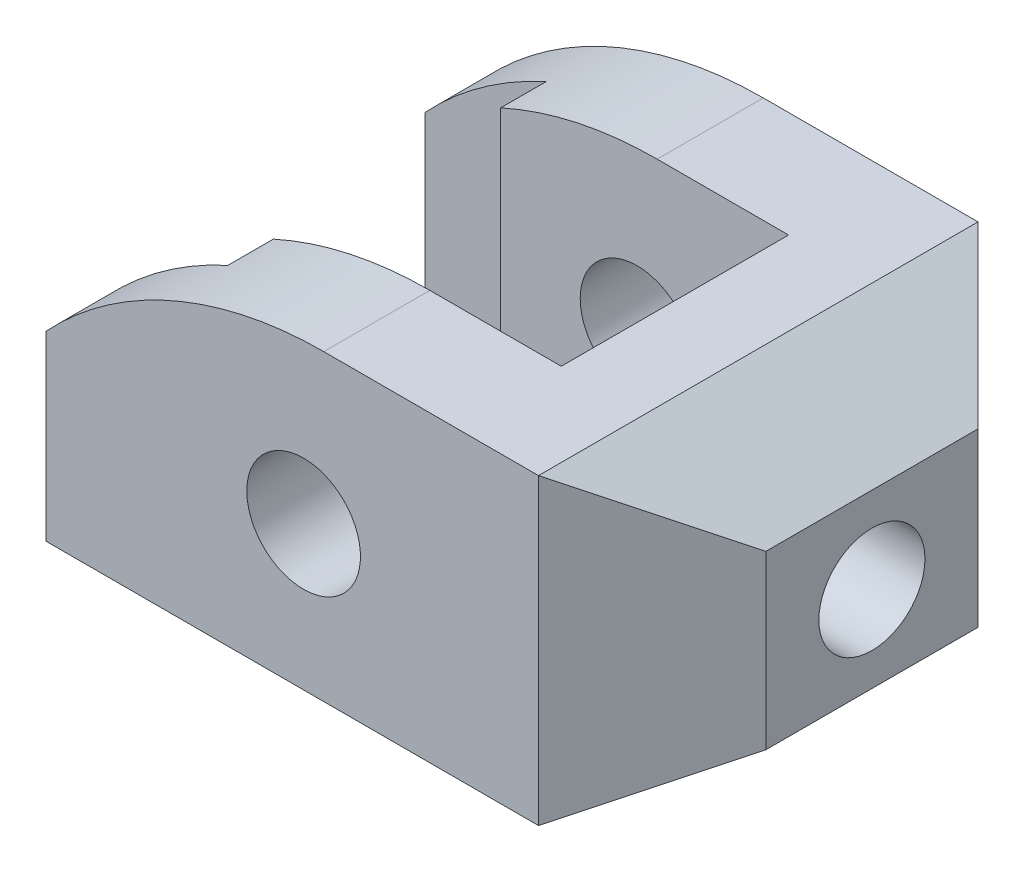
ISO-10303-21;
HEADER;
FILE_DESCRIPTION(('STEP AP214'),'2;1');
FILE_NAME('part.step','',(''),(''),'','','');
FILE_SCHEMA(('AUTOMOTIVE_DESIGN { 1 0 10303 214 1 1 1 1 }'));
ENDSEC;
DATA;
#1=APPLICATION_CONTEXT('core data for automotive mechanical design processes');
#2=APPLICATION_PROTOCOL_DEFINITION('international standard','automotive_design',2000,#1);
#3=PRODUCT_CONTEXT('',#1,'mechanical');
#4=PRODUCT('Part','Part','',(#3));
#5=PRODUCT_RELATED_PRODUCT_CATEGORY('part','',(#4));
#6=PRODUCT_DEFINITION_FORMATION('','',#4);
#7=PRODUCT_DEFINITION_CONTEXT('part definition',#1,'design');
#8=PRODUCT_DEFINITION('design','',#6,#7);
#9=PRODUCT_DEFINITION_SHAPE('','',#8);
#10=(LENGTH_UNIT() NAMED_UNIT(*) SI_UNIT(.MILLI.,.METRE.));
#11=(NAMED_UNIT(*) PLANE_ANGLE_UNIT() SI_UNIT($,.RADIAN.));
#12=(NAMED_UNIT(*) SI_UNIT($,.STERADIAN.) SOLID_ANGLE_UNIT());
#13=UNCERTAINTY_MEASURE_WITH_UNIT(LENGTH_MEASURE(1.E-05),#10,'distance_accuracy_value','');
#14=(GEOMETRIC_REPRESENTATION_CONTEXT(3) GLOBAL_UNCERTAINTY_ASSIGNED_CONTEXT((#13)) GLOBAL_UNIT_ASSIGNED_CONTEXT((#10,
#11,#12)) REPRESENTATION_CONTEXT('',''));
#15=CARTESIAN_POINT('',(0.,0.,0.));
#16=DIRECTION('',(0.,0.,1.));
#17=DIRECTION('',(1.,0.,0.));
#18=AXIS2_PLACEMENT_3D('',#15,#16,#17);
#19=CARTESIAN_POINT('',(-28.3393944403533,-10.,58.));
#20=DIRECTION('',(0.,0.,-1.));
#21=DIRECTION('',(-1.,0.,0.));
#22=AXIS2_PLACEMENT_3D('',#19,#20,#21);
#23=PLANE('',#22);
#24=CARTESIAN_POINT('',(-31.,19.,58.));
#25=DIRECTION('',(0.,0.,1.));
#26=DIRECTION('',(1.,0.,0.));
#27=AXIS2_PLACEMENT_3D('',#24,#25,#26);
#28=CIRCLE('',#27,7.5);
#29=CARTESIAN_POINT('',(-38.5,19.,58.));
#30=VERTEX_POINT('',#29);
#31=EDGE_CURVE('E207',#30,#30,#28,.T.);
#32=ORIENTED_EDGE('',*,*,#31,.F.);
#33=EDGE_LOOP('',(#32));
#34=FACE_BOUND('',#33,.T.);
#35=DIRECTION('',(0.,-1.,0.));
#36=VECTOR('',#35,1.);
#37=CARTESIAN_POINT('',(0.,40.,58.));
#38=LINE('',#37,#36);
#39=CARTESIAN_POINT('',(0.,40.,58.));
#40=VERTEX_POINT('',#39);
#41=CARTESIAN_POINT('',(0.,0.,58.));
#42=VERTEX_POINT('',#41);
#43=EDGE_CURVE('E156',#40,#42,#38,.T.);
#44=ORIENTED_EDGE('',*,*,#43,.F.);
#45=DIRECTION('',(-1.,0.,0.));
#46=VECTOR('',#45,1.);
#47=CARTESIAN_POINT('',(0.,40.,58.));
#48=LINE('',#47,#46);
#49=CARTESIAN_POINT('',(-28.3393944403533,40.,58.));
#50=VERTEX_POINT('',#49);
#51=EDGE_CURVE('E167',#40,#50,#48,.T.);
#52=ORIENTED_EDGE('',*,*,#51,.T.);
#53=CARTESIAN_POINT('',(-28.3393944403533,-10.,58.));
#54=DIRECTION('',(0.,0.,1.));
#55=DIRECTION('',(-1.,0.,0.));
#56=AXIS2_PLACEMENT_3D('',#53,#54,#55);
#57=CIRCLE('',#56,50.);
#58=CARTESIAN_POINT('',(-65.,24.,58.));
#59=VERTEX_POINT('',#58);
#60=EDGE_CURVE('E189',#50,#59,#57,.T.);
#61=ORIENTED_EDGE('',*,*,#60,.T.);
#62=DIRECTION('',(0.,-1.,0.));
#63=VECTOR('',#62,1.);
#64=CARTESIAN_POINT('',(-65.,0.,58.));
#65=LINE('',#64,#63);
#66=CARTESIAN_POINT('',(-65.,0.,58.));
#67=VERTEX_POINT('',#66);
#68=EDGE_CURVE('E192',#59,#67,#65,.T.);
#69=ORIENTED_EDGE('',*,*,#68,.T.);
#70=DIRECTION('',(1.,0.,0.));
#71=VECTOR('',#70,1.);
#72=CARTESIAN_POINT('',(0.,0.,58.));
#73=LINE('',#72,#71);
#74=EDGE_CURVE('E170',#67,#42,#73,.T.);
#75=ORIENTED_EDGE('',*,*,#74,.T.);
#76=EDGE_LOOP('',(#44,#52,#61,#69,#75));
#77=FACE_BOUND('',#76,.T.);
#78=ADVANCED_FACE('F43',(#34,#77),#23,.F.);
#79=CARTESIAN_POINT('',(-28.3393944403533,-10.,0.));
#80=DIRECTION('',(0.,0.,-1.));
#81=DIRECTION('',(-1.,0.,0.));
#82=AXIS2_PLACEMENT_3D('',#79,#80,#81);
#83=PLANE('',#82);
#84=CARTESIAN_POINT('',(-31.,19.,0.));
#85=DIRECTION('',(0.,0.,1.));
#86=DIRECTION('',(1.,0.,0.));
#87=AXIS2_PLACEMENT_3D('',#84,#85,#86);
#88=CIRCLE('',#87,7.5);
#89=CARTESIAN_POINT('',(-38.5,19.,0.));
#90=VERTEX_POINT('',#89);
#91=EDGE_CURVE('E198',#90,#90,#88,.T.);
#92=ORIENTED_EDGE('',*,*,#91,.T.);
#93=EDGE_LOOP('',(#92));
#94=FACE_BOUND('',#93,.T.);
#95=DIRECTION('',(-1.,0.,0.));
#96=VECTOR('',#95,1.);
#97=CARTESIAN_POINT('',(0.,40.,0.));
#98=LINE('',#97,#96);
#99=CARTESIAN_POINT('',(0.,40.,0.));
#100=VERTEX_POINT('',#99);
#101=CARTESIAN_POINT('',(-28.3393944403533,40.,0.));
#102=VERTEX_POINT('',#101);
#103=EDGE_CURVE('E204',#100,#102,#98,.T.);
#104=ORIENTED_EDGE('',*,*,#103,.F.);
#105=DIRECTION('',(0.,-1.,0.));
#106=VECTOR('',#105,1.);
#107=CARTESIAN_POINT('',(0.,40.,0.));
#108=LINE('',#107,#106);
#109=CARTESIAN_POINT('',(0.,0.,0.));
#110=VERTEX_POINT('',#109);
#111=EDGE_CURVE('E322',#100,#110,#108,.T.);
#112=ORIENTED_EDGE('',*,*,#111,.T.);
#113=DIRECTION('',(1.,0.,0.));
#114=VECTOR('',#113,1.);
#115=CARTESIAN_POINT('',(0.,0.,0.));
#116=LINE('',#115,#114);
#117=CARTESIAN_POINT('',(-65.,0.,0.));
#118=VERTEX_POINT('',#117);
#119=EDGE_CURVE('E190',#118,#110,#116,.T.);
#120=ORIENTED_EDGE('',*,*,#119,.F.);
#121=DIRECTION('',(0.,-1.,0.));
#122=VECTOR('',#121,1.);
#123=CARTESIAN_POINT('',(-65.,0.,0.));
#124=LINE('',#123,#122);
#125=CARTESIAN_POINT('',(-65.,24.,0.));
#126=VERTEX_POINT('',#125);
#127=EDGE_CURVE('E195',#126,#118,#124,.T.);
#128=ORIENTED_EDGE('',*,*,#127,.F.);
#129=CARTESIAN_POINT('',(-28.3393944403533,-10.,0.));
#130=DIRECTION('',(0.,0.,1.));
#131=DIRECTION('',(-1.,0.,0.));
#132=AXIS2_PLACEMENT_3D('',#129,#130,#131);
#133=CIRCLE('',#132,50.);
#134=EDGE_CURVE('E206',#102,#126,#133,.T.);
#135=ORIENTED_EDGE('',*,*,#134,.F.);
#136=EDGE_LOOP('',(#104,#112,#120,#128,#135));
#137=FACE_BOUND('',#136,.T.);
#138=ADVANCED_FACE('F263',(#94,#137),#83,.T.);
#139=CARTESIAN_POINT('',(0.,0.,58.));
#140=DIRECTION('',(-0.499999999999995,0.866025403784441,0.));
#141=DIRECTION('',(-0.866025403784442,-0.499999999999995,0.));
#142=AXIS2_PLACEMENT_3D('',#139,#140,#141);
#143=PLANE('',#142);
#144=DIRECTION('',(-0.654653670707977,-0.377964473009222,-0.65465367070798));
#145=VECTOR('',#144,1.);
#146=CARTESIAN_POINT('',(24.857142857143,14.3512781198563,24.857142857143));
#147=LINE('',#146,#145);
#148=CARTESIAN_POINT('',(15.,8.66025403784428,15.));
#149=VERTEX_POINT('',#148);
#150=EDGE_CURVE('E331',#149,#110,#147,.T.);
#151=ORIENTED_EDGE('',*,*,#150,.F.);
#152=DIRECTION('',(0.,0.,-1.));
#153=VECTOR('',#152,1.);
#154=CARTESIAN_POINT('',(15.,8.66025403784427,58.));
#155=LINE('',#154,#153);
#156=CARTESIAN_POINT('',(15.,8.66025403784428,43.));
#157=VERTEX_POINT('',#156);
#158=EDGE_CURVE('E162',#157,#149,#155,.T.);
#159=ORIENTED_EDGE('',*,*,#158,.F.);
#160=DIRECTION('',(0.654653670707977,0.377964473009222,-0.65465367070798));
#161=VECTOR('',#160,1.);
#162=CARTESIAN_POINT('',(0.,0.,58.));
#163=LINE('',#162,#161);
#164=EDGE_CURVE('E325',#42,#157,#163,.T.);
#165=ORIENTED_EDGE('',*,*,#164,.F.);
#166=DIRECTION('',(0.,0.,-1.));
#167=VECTOR('',#166,1.);
#168=CARTESIAN_POINT('',(0.,0.,58.));
#169=LINE('',#168,#167);
#170=EDGE_CURVE('E203',#42,#110,#169,.T.);
#171=ORIENTED_EDGE('',*,*,#170,.T.);
#172=EDGE_LOOP('',(#151,#159,#165,#171));
#173=FACE_BOUND('',#172,.T.);
#174=ADVANCED_FACE('F45',(#173),#143,.F.);
#175=CARTESIAN_POINT('',(15.,8.66025403784427,58.));
#176=DIRECTION('',(-1.,0.,0.));
#177=DIRECTION('',(0.,-1.,0.));
#178=AXIS2_PLACEMENT_3D('',#175,#176,#177);
#179=PLANE('',#178);
#180=CARTESIAN_POINT('',(15.,20.,29.));
#181=DIRECTION('',(-1.,0.,0.));
#182=DIRECTION('',(0.,-1.,0.));
#183=AXIS2_PLACEMENT_3D('',#180,#181,#182);
#184=CIRCLE('',#183,7.);
#185=CARTESIAN_POINT('',(15.,13.,29.));
#186=VERTEX_POINT('',#185);
#187=EDGE_CURVE('E317',#186,#186,#184,.T.);
#188=ORIENTED_EDGE('',*,*,#187,.T.);
#189=EDGE_LOOP('',(#188));
#190=FACE_BOUND('',#189,.T.);
#191=DIRECTION('',(0.,-1.,0.));
#192=VECTOR('',#191,1.);
#193=CARTESIAN_POINT('',(15.,40.,15.));
#194=LINE('',#193,#192);
#195=CARTESIAN_POINT('',(15.,31.3397459621556,15.));
#196=VERTEX_POINT('',#195);
#197=EDGE_CURVE('E172',#196,#149,#194,.T.);
#198=ORIENTED_EDGE('',*,*,#197,.F.);
#199=DIRECTION('',(0.,0.,-1.));
#200=VECTOR('',#199,1.);
#201=CARTESIAN_POINT('',(15.,31.3397459621556,58.));
#202=LINE('',#201,#200);
#203=CARTESIAN_POINT('',(15.,31.3397459621556,43.));
#204=VERTEX_POINT('',#203);
#205=EDGE_CURVE('E181',#204,#196,#202,.T.);
#206=ORIENTED_EDGE('',*,*,#205,.F.);
#207=DIRECTION('',(0.,-1.,0.));
#208=VECTOR('',#207,1.);
#209=CARTESIAN_POINT('',(15.,40.,43.));
#210=LINE('',#209,#208);
#211=EDGE_CURVE('E59',#204,#157,#210,.T.);
#212=ORIENTED_EDGE('',*,*,#211,.T.);
#213=ORIENTED_EDGE('',*,*,#158,.T.);
#214=EDGE_LOOP('',(#198,#206,#212,#213));
#215=FACE_BOUND('',#214,.T.);
#216=ADVANCED_FACE('F305',(#190,#215),#179,.F.);
#217=CARTESIAN_POINT('',(15.,31.3397459621556,58.));
#218=DIRECTION('',(-0.500000000000001,-0.866025403784438,0.));
#219=DIRECTION('',(0.866025403784438,-0.500000000000001,0.));
#220=AXIS2_PLACEMENT_3D('',#217,#218,#219);
#221=PLANE('',#220);
#222=DIRECTION('',(0.654653670707976,-0.377964473009227,0.654653670707978));
#223=VECTOR('',#222,1.);
#224=CARTESIAN_POINT('',(33.4285714285714,20.7000052870896,33.4285714285715));
#225=LINE('',#224,#223);
#226=EDGE_CURVE('E11',#100,#196,#225,.T.);
#227=ORIENTED_EDGE('',*,*,#226,.F.);
#228=DIRECTION('',(0.,0.,-1.));
#229=VECTOR('',#228,1.);
#230=CARTESIAN_POINT('',(0.,40.,58.));
#231=LINE('',#230,#229);
#232=EDGE_CURVE('E176',#40,#100,#231,.T.);
#233=ORIENTED_EDGE('',*,*,#232,.F.);
#234=DIRECTION('',(-0.654653670707976,0.377964473009227,0.654653670707978));
#235=VECTOR('',#234,1.);
#236=CARTESIAN_POINT('',(8.57142857142856,35.0512834069461,49.4285714285714));
#237=LINE('',#236,#235);
#238=EDGE_CURVE('E52',#204,#40,#237,.T.);
#239=ORIENTED_EDGE('',*,*,#238,.F.);
#240=ORIENTED_EDGE('',*,*,#205,.T.);
#241=EDGE_LOOP('',(#227,#233,#239,#240));
#242=FACE_BOUND('',#241,.T.);
#243=ADVANCED_FACE('F177',(#242),#221,.F.);
#244=CARTESIAN_POINT('',(-28.3393944403533,-10.,58.));
#245=DIRECTION('',(0.,0.,-1.));
#246=DIRECTION('',(-1.,0.,0.));
#247=AXIS2_PLACEMENT_3D('',#244,#245,#246);
#248=CYLINDRICAL_SURFACE('',#247,50.);
#249=DIRECTION('',(0.,0.,-1.));
#250=VECTOR('',#249,1.);
#251=CARTESIAN_POINT('',(-28.3393944403533,40.,58.));
#252=LINE('',#251,#250);
#253=CARTESIAN_POINT('',(-28.3393944403533,40.,44.));
#254=VERTEX_POINT('',#253);
#255=EDGE_CURVE('E182',#50,#254,#252,.T.);
#256=ORIENTED_EDGE('',*,*,#255,.T.);
#257=CARTESIAN_POINT('',(-28.3393944403533,-10.,44.));
#258=DIRECTION('',(0.,0.,1.));
#259=DIRECTION('',(1.,0.,0.));
#260=AXIS2_PLACEMENT_3D('',#257,#258,#259);
#261=CIRCLE('',#260,50.);
#262=CARTESIAN_POINT('',(-49.,35.5317403347236,44.));
#263=VERTEX_POINT('',#262);
#264=EDGE_CURVE('E230',#254,#263,#261,.T.);
#265=ORIENTED_EDGE('',*,*,#264,.T.);
#266=DIRECTION('',(0.,0.,-1.));
#267=VECTOR('',#266,1.);
#268=CARTESIAN_POINT('',(-49.,35.5317403347236,58.));
#269=LINE('',#268,#267);
#270=CARTESIAN_POINT('',(-49.,35.5317403347236,50.));
#271=VERTEX_POINT('',#270);
#272=EDGE_CURVE('E256',#263,#271,#269,.F.);
#273=ORIENTED_EDGE('',*,*,#272,.T.);
#274=CARTESIAN_POINT('',(-28.3393944403533,-10.,50.));
#275=DIRECTION('',(0.,0.,1.));
#276=DIRECTION('',(1.,0.,0.));
#277=AXIS2_PLACEMENT_3D('',#274,#275,#276);
#278=CIRCLE('',#277,50.);
#279=CARTESIAN_POINT('',(-65.,24.,50.));
#280=VERTEX_POINT('',#279);
#281=EDGE_CURVE('E253',#271,#280,#278,.T.);
#282=ORIENTED_EDGE('',*,*,#281,.T.);
#283=DIRECTION('',(0.,0.,-1.));
#284=VECTOR('',#283,1.);
#285=CARTESIAN_POINT('',(-65.,24.,58.));
#286=LINE('',#285,#284);
#287=EDGE_CURVE('E219',#59,#280,#286,.T.);
#288=ORIENTED_EDGE('',*,*,#287,.F.);
#289=ORIENTED_EDGE('',*,*,#60,.F.);
#290=EDGE_LOOP('',(#256,#265,#273,#282,#288,#289));
#291=FACE_BOUND('',#290,.T.);
#292=ADVANCED_FACE('F279',(#291),#248,.T.);
#293=CARTESIAN_POINT('',(-65.,0.,58.));
#294=DIRECTION('',(1.,0.,0.));
#295=DIRECTION('',(0.,0.,-1.));
#296=AXIS2_PLACEMENT_3D('',#293,#294,#295);
#297=PLANE('',#296);
#298=ORIENTED_EDGE('',*,*,#287,.T.);
#299=DIRECTION('',(0.,1.,0.));
#300=VECTOR('',#299,1.);
#301=CARTESIAN_POINT('',(-65.,0.,50.));
#302=LINE('',#301,#300);
#303=CARTESIAN_POINT('',(-65.,0.,50.));
#304=VERTEX_POINT('',#303);
#305=EDGE_CURVE('E369',#304,#280,#302,.T.);
#306=ORIENTED_EDGE('',*,*,#305,.F.);
#307=DIRECTION('',(0.,0.,-1.));
#308=VECTOR('',#307,1.);
#309=CARTESIAN_POINT('',(-65.,0.,58.));
#310=LINE('',#309,#308);
#311=EDGE_CURVE('E215',#67,#304,#310,.T.);
#312=ORIENTED_EDGE('',*,*,#311,.F.);
#313=ORIENTED_EDGE('',*,*,#68,.F.);
#314=EDGE_LOOP('',(#298,#306,#312,#313));
#315=FACE_BOUND('',#314,.T.);
#316=ADVANCED_FACE('F268',(#315),#297,.F.);
#317=CARTESIAN_POINT('',(-31.,19.,58.));
#318=DIRECTION('',(0.,0.,-1.));
#319=DIRECTION('',(-1.,0.,0.));
#320=AXIS2_PLACEMENT_3D('',#317,#318,#319);
#321=CYLINDRICAL_SURFACE('',#320,7.5);
#322=CARTESIAN_POINT('',(-31.,19.,14.));
#323=DIRECTION('',(0.,0.,-1.));
#324=DIRECTION('',(-1.,0.,0.));
#325=AXIS2_PLACEMENT_3D('',#322,#323,#324);
#326=CIRCLE('',#325,7.5);
#327=CARTESIAN_POINT('',(-38.5,19.,14.));
#328=VERTEX_POINT('',#327);
#329=EDGE_CURVE('E232',#328,#328,#326,.T.);
#330=CARTESIAN_POINT('',(-38.5,19.,14.));
#331=CARTESIAN_POINT('',(-38.5,19.,13.8541666666667));
#332=CARTESIAN_POINT('',(-38.5,19.,13.7083333333333));
#333=CARTESIAN_POINT('',(-38.5,19.,13.4166666666667));
#334=CARTESIAN_POINT('',(-38.5,19.,13.2708333333333));
#335=CARTESIAN_POINT('',(-38.5,19.,12.9791666666667));
#336=CARTESIAN_POINT('',(-38.5,19.,12.8333333333333));
#337=CARTESIAN_POINT('',(-38.5,19.,12.5416666666667));
#338=CARTESIAN_POINT('',(-38.5,19.,12.3958333333333));
#339=CARTESIAN_POINT('',(-38.5,19.,12.1041666666667));
#340=CARTESIAN_POINT('',(-38.5,19.,11.9583333333333));
#341=CARTESIAN_POINT('',(-38.5,19.,11.6666666666667));
#342=CARTESIAN_POINT('',(-38.5,19.,11.5208333333333));
#343=CARTESIAN_POINT('',(-38.5,19.,11.2291666666667));
#344=CARTESIAN_POINT('',(-38.5,19.,11.0833333333333));
#345=CARTESIAN_POINT('',(-38.5,19.,10.7916666666667));
#346=CARTESIAN_POINT('',(-38.5,19.,10.6458333333333));
#347=CARTESIAN_POINT('',(-38.5,19.,10.3541666666667));
#348=CARTESIAN_POINT('',(-38.5,19.,10.2083333333333));
#349=CARTESIAN_POINT('',(-38.5,19.,9.91666666666667));
#350=CARTESIAN_POINT('',(-38.5,19.,9.77083333333333));
#351=CARTESIAN_POINT('',(-38.5,19.,9.47916666666667));
#352=CARTESIAN_POINT('',(-38.5,19.,9.33333333333333));
#353=CARTESIAN_POINT('',(-38.5,19.,9.04166666666667));
#354=CARTESIAN_POINT('',(-38.5,19.,8.89583333333333));
#355=CARTESIAN_POINT('',(-38.5,19.,8.60416666666667));
#356=CARTESIAN_POINT('',(-38.5,19.,8.45833333333333));
#357=CARTESIAN_POINT('',(-38.5,19.,8.16666666666667));
#358=CARTESIAN_POINT('',(-38.5,19.,8.02083333333333));
#359=CARTESIAN_POINT('',(-38.5,19.,7.72916666666667));
#360=CARTESIAN_POINT('',(-38.5,19.,7.58333333333333));
#361=CARTESIAN_POINT('',(-38.5,19.,7.29166666666667));
#362=CARTESIAN_POINT('',(-38.5,19.,7.14583333333333));
#363=CARTESIAN_POINT('',(-38.5,19.,6.85416666666667));
#364=CARTESIAN_POINT('',(-38.5,19.,6.70833333333333));
#365=CARTESIAN_POINT('',(-38.5,19.,6.41666666666667));
#366=CARTESIAN_POINT('',(-38.5,19.,6.27083333333333));
#367=CARTESIAN_POINT('',(-38.5,19.,5.97916666666667));
#368=CARTESIAN_POINT('',(-38.5,19.,5.83333333333333));
#369=CARTESIAN_POINT('',(-38.5,19.,5.54166666666666));
#370=CARTESIAN_POINT('',(-38.5,19.,5.39583333333333));
#371=CARTESIAN_POINT('',(-38.5,19.,5.10416666666666));
#372=CARTESIAN_POINT('',(-38.5,19.,4.95833333333333));
#373=CARTESIAN_POINT('',(-38.5,19.,4.66666666666667));
#374=CARTESIAN_POINT('',(-38.5,19.,4.52083333333333));
#375=CARTESIAN_POINT('',(-38.5,19.,4.22916666666667));
#376=CARTESIAN_POINT('',(-38.5,19.,4.08333333333333));
#377=CARTESIAN_POINT('',(-38.5,19.,3.79166666666667));
#378=CARTESIAN_POINT('',(-38.5,19.,3.64583333333333));
#379=CARTESIAN_POINT('',(-38.5,19.,3.35416666666667));
#380=CARTESIAN_POINT('',(-38.5,19.,3.20833333333333));
#381=CARTESIAN_POINT('',(-38.5,19.,2.91666666666666));
#382=CARTESIAN_POINT('',(-38.5,19.,2.77083333333333));
#383=CARTESIAN_POINT('',(-38.5,19.,2.47916666666667));
#384=CARTESIAN_POINT('',(-38.5,19.,2.33333333333334));
#385=CARTESIAN_POINT('',(-38.5,19.,2.04166666666667));
#386=CARTESIAN_POINT('',(-38.5,19.,1.89583333333333));
#387=CARTESIAN_POINT('',(-38.5,19.,1.60416666666667));
#388=CARTESIAN_POINT('',(-38.5,19.,1.45833333333333));
#389=CARTESIAN_POINT('',(-38.5,19.,1.16666666666667));
#390=CARTESIAN_POINT('',(-38.5,19.,1.02083333333333));
#391=CARTESIAN_POINT('',(-38.5,19.,0.729166666666667));
#392=CARTESIAN_POINT('',(-38.5,19.,0.583333333333334));
#393=CARTESIAN_POINT('',(-38.5,19.,0.291666666666667));
#394=CARTESIAN_POINT('',(-38.5,19.,0.145833333333333));
#395=CARTESIAN_POINT('',(-38.5,19.,0.));
#396=B_SPLINE_CURVE_WITH_KNOTS('',3,(#330,#331,#332,#333,#334,#335,#336,#337,#338,#339,#340,
#341,#342,#343,#344,#345,#346,#347,#348,#349,#350,#351,#352,#353,#354,#355,#356,#357,#358,#359,
#360,#361,#362,#363,#364,#365,#366,#367,#368,#369,#370,#371,#372,#373,#374,#375,#376,#377,#378,
#379,#380,#381,#382,#383,#384,#385,#386,#387,#388,#389,#390,#391,#392,#393,#394,#395),
.UNSPECIFIED.,.F.,.F.,(4,2,2,2,2,2,2,2,2,2,2,2,2,2,2,2,2,2,2,2,2,2,2,2,2,2,2,2,2,2,2,2,4),(0.,
0.4375,0.875000000000001,1.3125,1.75,2.1875,2.625,3.0625,3.5,3.9375,4.375,4.8125,5.25,5.6875,
6.125,6.5625,7.,7.4375,7.875,8.3125,8.75,9.1875,9.62499999999999,10.0625,10.5,10.9375,11.375,
11.8125,12.25,12.6875,13.125,13.5625,14.),.UNSPECIFIED.);
#397=EDGE_CURVE('BSEAM266',#328,#90,#396,.T.);
#398=ORIENTED_EDGE('',*,*,#329,.F.);
#399=ORIENTED_EDGE('',*,*,#91,.F.);
#400=ORIENTED_EDGE('',*,*,#397,.T.);
#401=ORIENTED_EDGE('',*,*,#397,.F.);
#402=EDGE_LOOP('',(#398,#400,#399,#401));
#403=FACE_BOUND('',#402,.T.);
#404=ADVANCED_FACE('F266',(#403),#321,.F.);
#405=CARTESIAN_POINT('',(0.,40.,58.));
#406=DIRECTION('',(0.,-1.,0.));
#407=DIRECTION('',(1.,0.,0.));
#408=AXIS2_PLACEMENT_3D('',#405,#406,#407);
#409=PLANE('',#408);
#410=CARTESIAN_POINT('',(-28.3393944403533,40.,14.));
#411=VERTEX_POINT('',#410);
#412=EDGE_CURVE('E222',#411,#102,#252,.T.);
#413=ORIENTED_EDGE('',*,*,#412,.F.);
#414=DIRECTION('',(-1.,0.,0.));
#415=VECTOR('',#414,1.);
#416=CARTESIAN_POINT('',(-11.,40.,14.));
#417=LINE('',#416,#415);
#418=CARTESIAN_POINT('',(-11.,40.,14.));
#419=VERTEX_POINT('',#418);
#420=EDGE_CURVE('E333',#419,#411,#417,.T.);
#421=ORIENTED_EDGE('',*,*,#420,.F.);
#422=DIRECTION('',(0.,0.,-1.));
#423=VECTOR('',#422,1.);
#424=CARTESIAN_POINT('',(-11.,40.,44.));
#425=LINE('',#424,#423);
#426=CARTESIAN_POINT('',(-11.,40.,44.));
#427=VERTEX_POINT('',#426);
#428=EDGE_CURVE('E337',#427,#419,#425,.T.);
#429=ORIENTED_EDGE('',*,*,#428,.F.);
#430=DIRECTION('',(1.,0.,0.));
#431=VECTOR('',#430,1.);
#432=CARTESIAN_POINT('',(-11.,40.,44.));
#433=LINE('',#432,#431);
#434=EDGE_CURVE('E335',#254,#427,#433,.T.);
#435=ORIENTED_EDGE('',*,*,#434,.F.);
#436=ORIENTED_EDGE('',*,*,#255,.F.);
#437=ORIENTED_EDGE('',*,*,#51,.F.);
#438=ORIENTED_EDGE('',*,*,#232,.T.);
#439=ORIENTED_EDGE('',*,*,#103,.T.);
#440=EDGE_LOOP('',(#413,#421,#429,#435,#436,#437,#438,#439));
#441=FACE_BOUND('',#440,.T.);
#442=ADVANCED_FACE('F185',(#441),#409,.F.);
#443=DIRECTION('',(0.,0.,-1.));
#444=VECTOR('',#443,1.);
#445=CARTESIAN_POINT('',(-49.,35.5317403347236,58.));
#446=LINE('',#445,#444);
#447=CARTESIAN_POINT('',(-49.,35.5317403347236,8.));
#448=VERTEX_POINT('',#447);
#449=CARTESIAN_POINT('',(-49.,35.5317403347236,14.));
#450=VERTEX_POINT('',#449);
#451=EDGE_CURVE('E238',#448,#450,#446,.F.);
#452=ORIENTED_EDGE('',*,*,#451,.T.);
#453=CARTESIAN_POINT('',(-28.3393944403533,-10.,14.));
#454=DIRECTION('',(0.,0.,-1.));
#455=DIRECTION('',(-1.,0.,0.));
#456=AXIS2_PLACEMENT_3D('',#453,#454,#455);
#457=CIRCLE('',#456,50.);
#458=EDGE_CURVE('E234',#450,#411,#457,.T.);
#459=ORIENTED_EDGE('',*,*,#458,.T.);
#460=ORIENTED_EDGE('',*,*,#412,.T.);
#461=ORIENTED_EDGE('',*,*,#134,.T.);
#462=CARTESIAN_POINT('',(-65.,24.,8.));
#463=VERTEX_POINT('',#462);
#464=EDGE_CURVE('E218',#463,#126,#286,.T.);
#465=ORIENTED_EDGE('',*,*,#464,.F.);
#466=CARTESIAN_POINT('',(-28.3393944403533,-10.,8.));
#467=DIRECTION('',(0.,0.,-1.));
#468=DIRECTION('',(-1.,0.,0.));
#469=AXIS2_PLACEMENT_3D('',#466,#467,#468);
#470=CIRCLE('',#469,50.);
#471=EDGE_CURVE('E250',#463,#448,#470,.T.);
#472=ORIENTED_EDGE('',*,*,#471,.T.);
#473=EDGE_LOOP('',(#452,#459,#460,#461,#465,#472));
#474=FACE_BOUND('',#473,.T.);
#475=ADVANCED_FACE('F277',(#474),#248,.T.);
#476=CARTESIAN_POINT('',(-65.,0.,8.));
#477=VERTEX_POINT('',#476);
#478=EDGE_CURVE('E214',#477,#118,#310,.T.);
#479=ORIENTED_EDGE('',*,*,#478,.F.);
#480=DIRECTION('',(0.,1.,0.));
#481=VECTOR('',#480,1.);
#482=CARTESIAN_POINT('',(-65.,0.,8.));
#483=LINE('',#482,#481);
#484=EDGE_CURVE('E371',#477,#463,#483,.T.);
#485=ORIENTED_EDGE('',*,*,#484,.T.);
#486=ORIENTED_EDGE('',*,*,#464,.T.);
#487=ORIENTED_EDGE('',*,*,#127,.T.);
#488=EDGE_LOOP('',(#479,#485,#486,#487));
#489=FACE_BOUND('',#488,.T.);
#490=ADVANCED_FACE('F282',(#489),#297,.F.);
#491=CARTESIAN_POINT('',(0.,0.,58.));
#492=DIRECTION('',(0.,1.,0.));
#493=DIRECTION('',(0.,0.,1.));
#494=AXIS2_PLACEMENT_3D('',#491,#492,#493);
#495=PLANE('',#494);
#496=ORIENTED_EDGE('',*,*,#311,.T.);
#497=DIRECTION('',(1.,0.,0.));
#498=VECTOR('',#497,1.);
#499=CARTESIAN_POINT('',(-49.,0.,50.));
#500=LINE('',#499,#498);
#501=CARTESIAN_POINT('',(-49.,0.,50.));
#502=VERTEX_POINT('',#501);
#503=EDGE_CURVE('E347',#304,#502,#500,.T.);
#504=ORIENTED_EDGE('',*,*,#503,.T.);
#505=DIRECTION('',(0.,0.,-1.));
#506=VECTOR('',#505,1.);
#507=CARTESIAN_POINT('',(-49.,0.,44.));
#508=LINE('',#507,#506);
#509=CARTESIAN_POINT('',(-49.,0.,44.));
#510=VERTEX_POINT('',#509);
#511=EDGE_CURVE('E350',#502,#510,#508,.T.);
#512=ORIENTED_EDGE('',*,*,#511,.T.);
#513=DIRECTION('',(1.,0.,0.));
#514=VECTOR('',#513,1.);
#515=CARTESIAN_POINT('',(-11.,0.,44.));
#516=LINE('',#515,#514);
#517=CARTESIAN_POINT('',(-11.,0.,44.));
#518=VERTEX_POINT('',#517);
#519=EDGE_CURVE('E353',#510,#518,#516,.T.);
#520=ORIENTED_EDGE('',*,*,#519,.T.);
#521=DIRECTION('',(0.,0.,-1.));
#522=VECTOR('',#521,1.);
#523=CARTESIAN_POINT('',(-11.,0.,44.));
#524=LINE('',#523,#522);
#525=CARTESIAN_POINT('',(-11.,0.,14.));
#526=VERTEX_POINT('',#525);
#527=EDGE_CURVE('E356',#518,#526,#524,.T.);
#528=ORIENTED_EDGE('',*,*,#527,.T.);
#529=DIRECTION('',(-1.,0.,0.));
#530=VECTOR('',#529,1.);
#531=CARTESIAN_POINT('',(-11.,0.,14.));
#532=LINE('',#531,#530);
#533=CARTESIAN_POINT('',(-49.,0.,14.));
#534=VERTEX_POINT('',#533);
#535=EDGE_CURVE('E340',#526,#534,#532,.T.);
#536=ORIENTED_EDGE('',*,*,#535,.T.);
#537=DIRECTION('',(0.,0.,-1.));
#538=VECTOR('',#537,1.);
#539=CARTESIAN_POINT('',(-49.,0.,14.));
#540=LINE('',#539,#538);
#541=CARTESIAN_POINT('',(-49.,0.,8.));
#542=VERTEX_POINT('',#541);
#543=EDGE_CURVE('E343',#534,#542,#540,.T.);
#544=ORIENTED_EDGE('',*,*,#543,.T.);
#545=DIRECTION('',(-1.,0.,0.));
#546=VECTOR('',#545,1.);
#547=CARTESIAN_POINT('',(-49.,0.,8.));
#548=LINE('',#547,#546);
#549=EDGE_CURVE('E67',#542,#477,#548,.T.);
#550=ORIENTED_EDGE('',*,*,#549,.T.);
#551=ORIENTED_EDGE('',*,*,#478,.T.);
#552=ORIENTED_EDGE('',*,*,#119,.T.);
#553=ORIENTED_EDGE('',*,*,#170,.F.);
#554=ORIENTED_EDGE('',*,*,#74,.F.);
#555=EDGE_LOOP('',(#496,#504,#512,#520,#528,#536,#544,#550,#551,#552,#553,#554));
#556=FACE_BOUND('',#555,.T.);
#557=ADVANCED_FACE('F287',(#556),#495,.F.);
#558=CARTESIAN_POINT('',(-31.,19.,44.));
#559=DIRECTION('',(0.,0.,1.));
#560=DIRECTION('',(1.,0.,0.));
#561=AXIS2_PLACEMENT_3D('',#558,#559,#560);
#562=CIRCLE('',#561,7.5);
#563=CARTESIAN_POINT('',(-38.5,19.,44.));
#564=VERTEX_POINT('',#563);
#565=EDGE_CURVE('E227',#564,#564,#562,.T.);
#566=CARTESIAN_POINT('',(-38.5,19.,44.));
#567=CARTESIAN_POINT('',(-38.5,19.,44.1458333333333));
#568=CARTESIAN_POINT('',(-38.5,19.,44.2916666666667));
#569=CARTESIAN_POINT('',(-38.5,19.,44.5833333333333));
#570=CARTESIAN_POINT('',(-38.5,19.,44.7291666666667));
#571=CARTESIAN_POINT('',(-38.5,19.,45.0208333333333));
#572=CARTESIAN_POINT('',(-38.5,19.,45.1666666666667));
#573=CARTESIAN_POINT('',(-38.5,19.,45.4583333333333));
#574=CARTESIAN_POINT('',(-38.5,19.,45.6041666666667));
#575=CARTESIAN_POINT('',(-38.5,19.,45.8958333333333));
#576=CARTESIAN_POINT('',(-38.5,19.,46.0416666666667));
#577=CARTESIAN_POINT('',(-38.5,19.,46.3333333333333));
#578=CARTESIAN_POINT('',(-38.5,19.,46.4791666666667));
#579=CARTESIAN_POINT('',(-38.5,19.,46.7708333333333));
#580=CARTESIAN_POINT('',(-38.5,19.,46.9166666666667));
#581=CARTESIAN_POINT('',(-38.5,19.,47.2083333333333));
#582=CARTESIAN_POINT('',(-38.5,19.,47.3541666666667));
#583=CARTESIAN_POINT('',(-38.5,19.,47.6458333333333));
#584=CARTESIAN_POINT('',(-38.5,19.,47.7916666666667));
#585=CARTESIAN_POINT('',(-38.5,19.,48.0833333333333));
#586=CARTESIAN_POINT('',(-38.5,19.,48.2291666666667));
#587=CARTESIAN_POINT('',(-38.5,19.,48.5208333333333));
#588=CARTESIAN_POINT('',(-38.5,19.,48.6666666666667));
#589=CARTESIAN_POINT('',(-38.5,19.,48.9583333333333));
#590=CARTESIAN_POINT('',(-38.5,19.,49.1041666666667));
#591=CARTESIAN_POINT('',(-38.5,19.,49.3958333333333));
#592=CARTESIAN_POINT('',(-38.5,19.,49.5416666666667));
#593=CARTESIAN_POINT('',(-38.5,19.,49.8333333333333));
#594=CARTESIAN_POINT('',(-38.5,19.,49.9791666666667));
#595=CARTESIAN_POINT('',(-38.5,19.,50.2708333333333));
#596=CARTESIAN_POINT('',(-38.5,19.,50.4166666666667));
#597=CARTESIAN_POINT('',(-38.5,19.,50.7083333333333));
#598=CARTESIAN_POINT('',(-38.5,19.,50.8541666666667));
#599=CARTESIAN_POINT('',(-38.5,19.,51.1458333333333));
#600=CARTESIAN_POINT('',(-38.5,19.,51.2916666666667));
#601=CARTESIAN_POINT('',(-38.5,19.,51.5833333333333));
#602=CARTESIAN_POINT('',(-38.5,19.,51.7291666666667));
#603=CARTESIAN_POINT('',(-38.5,19.,52.0208333333333));
#604=CARTESIAN_POINT('',(-38.5,19.,52.1666666666667));
#605=CARTESIAN_POINT('',(-38.5,19.,52.4583333333333));
#606=CARTESIAN_POINT('',(-38.5,19.,52.6041666666667));
#607=CARTESIAN_POINT('',(-38.5,19.,52.8958333333333));
#608=CARTESIAN_POINT('',(-38.5,19.,53.0416666666667));
#609=CARTESIAN_POINT('',(-38.5,19.,53.3333333333333));
#610=CARTESIAN_POINT('',(-38.5,19.,53.4791666666667));
#611=CARTESIAN_POINT('',(-38.5,19.,53.7708333333333));
#612=CARTESIAN_POINT('',(-38.5,19.,53.9166666666667));
#613=CARTESIAN_POINT('',(-38.5,19.,54.2083333333333));
#614=CARTESIAN_POINT('',(-38.5,19.,54.3541666666667));
#615=CARTESIAN_POINT('',(-38.5,19.,54.6458333333333));
#616=CARTESIAN_POINT('',(-38.5,19.,54.7916666666667));
#617=CARTESIAN_POINT('',(-38.5,19.,55.0833333333333));
#618=CARTESIAN_POINT('',(-38.5,19.,55.2291666666667));
#619=CARTESIAN_POINT('',(-38.5,19.,55.5208333333333));
#620=CARTESIAN_POINT('',(-38.5,19.,55.6666666666667));
#621=CARTESIAN_POINT('',(-38.5,19.,55.9583333333333));
#622=CARTESIAN_POINT('',(-38.5,19.,56.1041666666667));
#623=CARTESIAN_POINT('',(-38.5,19.,56.3958333333333));
#624=CARTESIAN_POINT('',(-38.5,19.,56.5416666666667));
#625=CARTESIAN_POINT('',(-38.5,19.,56.8333333333333));
#626=CARTESIAN_POINT('',(-38.5,19.,56.9791666666667));
#627=CARTESIAN_POINT('',(-38.5,19.,57.2708333333333));
#628=CARTESIAN_POINT('',(-38.5,19.,57.4166666666667));
#629=CARTESIAN_POINT('',(-38.5,19.,57.7083333333333));
#630=CARTESIAN_POINT('',(-38.5,19.,57.8541666666667));
#631=CARTESIAN_POINT('',(-38.5,19.,58.));
#632=B_SPLINE_CURVE_WITH_KNOTS('',3,(#566,#567,#568,#569,#570,#571,#572,#573,#574,#575,#576,
#577,#578,#579,#580,#581,#582,#583,#584,#585,#586,#587,#588,#589,#590,#591,#592,#593,#594,#595,
#596,#597,#598,#599,#600,#601,#602,#603,#604,#605,#606,#607,#608,#609,#610,#611,#612,#613,#614,
#615,#616,#617,#618,#619,#620,#621,#622,#623,#624,#625,#626,#627,#628,#629,#630,#631),
.UNSPECIFIED.,.F.,.F.,(4,2,2,2,2,2,2,2,2,2,2,2,2,2,2,2,2,2,2,2,2,2,2,2,2,2,2,2,2,2,2,2,4),(0.,
0.4375,0.875000000000001,1.3125,1.75,2.1875,2.625,3.0625,3.5,3.9375,4.375,4.8125,5.25,
5.68749999999999,6.12499999999999,6.56249999999999,6.99999999999999,7.43749999999999,
7.87499999999999,8.31249999999999,8.74999999999999,9.18749999999999,9.62499999999999,10.0625,
10.5,10.9375,11.375,11.8125,12.25,12.6875,13.125,13.5625,14.),.UNSPECIFIED.);
#633=EDGE_CURVE('BSEAM271',#564,#30,#632,.T.);
#634=ORIENTED_EDGE('',*,*,#565,.F.);
#635=ORIENTED_EDGE('',*,*,#31,.T.);
#636=ORIENTED_EDGE('',*,*,#633,.T.);
#637=ORIENTED_EDGE('',*,*,#633,.F.);
#638=EDGE_LOOP('',(#634,#636,#635,#637));
#639=FACE_BOUND('',#638,.T.);
#640=ADVANCED_FACE('F271',(#639),#321,.F.);
#641=CARTESIAN_POINT('',(-49.,0.,44.));
#642=DIRECTION('',(1.,0.,0.));
#643=DIRECTION('',(0.,1.,0.));
#644=AXIS2_PLACEMENT_3D('',#641,#642,#643);
#645=PLANE('',#644);
#646=DIRECTION('',(0.,1.,0.));
#647=VECTOR('',#646,1.);
#648=CARTESIAN_POINT('',(-49.,0.,44.));
#649=LINE('',#648,#647);
#650=EDGE_CURVE('E363',#510,#263,#649,.T.);
#651=ORIENTED_EDGE('',*,*,#650,.F.);
#652=ORIENTED_EDGE('',*,*,#511,.F.);
#653=DIRECTION('',(0.,1.,0.));
#654=VECTOR('',#653,1.);
#655=CARTESIAN_POINT('',(-49.,0.,50.));
#656=LINE('',#655,#654);
#657=EDGE_CURVE('E366',#502,#271,#656,.T.);
#658=ORIENTED_EDGE('',*,*,#657,.T.);
#659=ORIENTED_EDGE('',*,*,#272,.F.);
#660=EDGE_LOOP('',(#651,#652,#658,#659));
#661=FACE_BOUND('',#660,.T.);
#662=ADVANCED_FACE('F286',(#661),#645,.F.);
#663=CARTESIAN_POINT('',(-49.,0.,50.));
#664=DIRECTION('',(0.,0.,1.));
#665=DIRECTION('',(1.,0.,0.));
#666=AXIS2_PLACEMENT_3D('',#663,#664,#665);
#667=PLANE('',#666);
#668=ORIENTED_EDGE('',*,*,#657,.F.);
#669=ORIENTED_EDGE('',*,*,#503,.F.);
#670=ORIENTED_EDGE('',*,*,#305,.T.);
#671=ORIENTED_EDGE('',*,*,#281,.F.);
#672=EDGE_LOOP('',(#668,#669,#670,#671));
#673=FACE_BOUND('',#672,.T.);
#674=ADVANCED_FACE('F398',(#673),#667,.F.);
#675=CARTESIAN_POINT('',(-49.,0.,8.));
#676=DIRECTION('',(0.,0.,-1.));
#677=DIRECTION('',(-1.,0.,0.));
#678=AXIS2_PLACEMENT_3D('',#675,#676,#677);
#679=PLANE('',#678);
#680=ORIENTED_EDGE('',*,*,#484,.F.);
#681=ORIENTED_EDGE('',*,*,#549,.F.);
#682=DIRECTION('',(0.,1.,0.));
#683=VECTOR('',#682,1.);
#684=CARTESIAN_POINT('',(-49.,0.,8.));
#685=LINE('',#684,#683);
#686=EDGE_CURVE('E373',#542,#448,#685,.T.);
#687=ORIENTED_EDGE('',*,*,#686,.T.);
#688=ORIENTED_EDGE('',*,*,#471,.F.);
#689=EDGE_LOOP('',(#680,#681,#687,#688));
#690=FACE_BOUND('',#689,.T.);
#691=ADVANCED_FACE('F381',(#690),#679,.F.);
#692=CARTESIAN_POINT('',(-49.,0.,14.));
#693=DIRECTION('',(1.,0.,0.));
#694=DIRECTION('',(0.,1.,0.));
#695=AXIS2_PLACEMENT_3D('',#692,#693,#694);
#696=PLANE('',#695);
#697=ORIENTED_EDGE('',*,*,#686,.F.);
#698=ORIENTED_EDGE('',*,*,#543,.F.);
#699=DIRECTION('',(0.,1.,0.));
#700=VECTOR('',#699,1.);
#701=CARTESIAN_POINT('',(-49.,0.,14.));
#702=LINE('',#701,#700);
#703=EDGE_CURVE('E245',#534,#450,#702,.T.);
#704=ORIENTED_EDGE('',*,*,#703,.T.);
#705=ORIENTED_EDGE('',*,*,#451,.F.);
#706=EDGE_LOOP('',(#697,#698,#704,#705));
#707=FACE_BOUND('',#706,.T.);
#708=ADVANCED_FACE('F377',(#707),#696,.F.);
#709=CARTESIAN_POINT('',(-11.,0.,14.));
#710=DIRECTION('',(0.,0.,-1.));
#711=DIRECTION('',(-1.,0.,0.));
#712=AXIS2_PLACEMENT_3D('',#709,#710,#711);
#713=PLANE('',#712);
#714=ORIENTED_EDGE('',*,*,#329,.T.);
#715=EDGE_LOOP('',(#714));
#716=FACE_BOUND('',#715,.T.);
#717=ORIENTED_EDGE('',*,*,#703,.F.);
#718=ORIENTED_EDGE('',*,*,#535,.F.);
#719=DIRECTION('',(0.,1.,0.));
#720=VECTOR('',#719,1.);
#721=CARTESIAN_POINT('',(-11.,0.,14.));
#722=LINE('',#721,#720);
#723=EDGE_CURVE('E231',#526,#419,#722,.T.);
#724=ORIENTED_EDGE('',*,*,#723,.T.);
#725=ORIENTED_EDGE('',*,*,#420,.T.);
#726=ORIENTED_EDGE('',*,*,#458,.F.);
#727=EDGE_LOOP('',(#717,#718,#724,#725,#726));
#728=FACE_BOUND('',#727,.T.);
#729=ADVANCED_FACE('F386',(#716,#728),#713,.F.);
#730=CARTESIAN_POINT('',(-11.,0.,44.));
#731=DIRECTION('',(0.,0.,1.));
#732=DIRECTION('',(1.,0.,0.));
#733=AXIS2_PLACEMENT_3D('',#730,#731,#732);
#734=PLANE('',#733);
#735=ORIENTED_EDGE('',*,*,#565,.T.);
#736=EDGE_LOOP('',(#735));
#737=FACE_BOUND('',#736,.T.);
#738=ORIENTED_EDGE('',*,*,#434,.T.);
#739=DIRECTION('',(0.,1.,0.));
#740=VECTOR('',#739,1.);
#741=CARTESIAN_POINT('',(-11.,0.,44.));
#742=LINE('',#741,#740);
#743=EDGE_CURVE('E360',#518,#427,#742,.T.);
#744=ORIENTED_EDGE('',*,*,#743,.F.);
#745=ORIENTED_EDGE('',*,*,#519,.F.);
#746=ORIENTED_EDGE('',*,*,#650,.T.);
#747=ORIENTED_EDGE('',*,*,#264,.F.);
#748=EDGE_LOOP('',(#738,#744,#745,#746,#747));
#749=FACE_BOUND('',#748,.T.);
#750=ADVANCED_FACE('F403',(#737,#749),#734,.F.);
#751=CARTESIAN_POINT('',(-11.,0.,44.));
#752=DIRECTION('',(1.,0.,0.));
#753=DIRECTION('',(0.,1.,0.));
#754=AXIS2_PLACEMENT_3D('',#751,#752,#753);
#755=PLANE('',#754);
#756=CARTESIAN_POINT('',(-11.,20.,29.));
#757=DIRECTION('',(1.,0.,0.));
#758=DIRECTION('',(0.,1.,0.));
#759=AXIS2_PLACEMENT_3D('',#756,#757,#758);
#760=CIRCLE('',#759,7.);
#761=CARTESIAN_POINT('',(-11.,27.,29.));
#762=VERTEX_POINT('',#761);
#763=EDGE_CURVE('E47',#762,#762,#760,.T.);
#764=ORIENTED_EDGE('',*,*,#763,.T.);
#765=EDGE_LOOP('',(#764));
#766=FACE_BOUND('',#765,.T.);
#767=ORIENTED_EDGE('',*,*,#723,.F.);
#768=ORIENTED_EDGE('',*,*,#527,.F.);
#769=ORIENTED_EDGE('',*,*,#743,.T.);
#770=ORIENTED_EDGE('',*,*,#428,.T.);
#771=EDGE_LOOP('',(#767,#768,#769,#770));
#772=FACE_BOUND('',#771,.T.);
#773=ADVANCED_FACE('F390',(#766,#772),#755,.F.);
#774=CARTESIAN_POINT('',(0.,40.,58.));
#775=DIRECTION('',(0.707106781186549,0.,0.707106781186546));
#776=DIRECTION('',(0.707106781186546,0.,-0.707106781186549));
#777=AXIS2_PLACEMENT_3D('',#774,#775,#776);
#778=PLANE('',#777);
#779=ORIENTED_EDGE('',*,*,#164,.T.);
#780=ORIENTED_EDGE('',*,*,#211,.F.);
#781=ORIENTED_EDGE('',*,*,#238,.T.);
#782=ORIENTED_EDGE('',*,*,#43,.T.);
#783=EDGE_LOOP('',(#779,#780,#781,#782));
#784=FACE_BOUND('',#783,.T.);
#785=ADVANCED_FACE('F155',(#784),#778,.T.);
#786=CARTESIAN_POINT('',(0.,40.,0.));
#787=DIRECTION('',(0.707106781186549,0.,-0.707106781186546));
#788=DIRECTION('',(-0.707106781186546,0.,-0.707106781186549));
#789=AXIS2_PLACEMENT_3D('',#786,#787,#788);
#790=PLANE('',#789);
#791=ORIENTED_EDGE('',*,*,#150,.T.);
#792=ORIENTED_EDGE('',*,*,#111,.F.);
#793=ORIENTED_EDGE('',*,*,#226,.T.);
#794=ORIENTED_EDGE('',*,*,#197,.T.);
#795=EDGE_LOOP('',(#791,#792,#793,#794));
#796=FACE_BOUND('',#795,.T.);
#797=ADVANCED_FACE('F392',(#796),#790,.T.);
#798=CARTESIAN_POINT('',(-65.,20.,29.));
#799=DIRECTION('',(1.,0.,0.));
#800=DIRECTION('',(0.,1.,0.));
#801=AXIS2_PLACEMENT_3D('',#798,#799,#800);
#802=CYLINDRICAL_SURFACE('',#801,7.);
#803=ORIENTED_EDGE('',*,*,#763,.F.);
#804=EDGE_LOOP('',(#803));
#805=FACE_BOUND('',#804,.T.);
#806=ORIENTED_EDGE('',*,*,#187,.F.);
#807=EDGE_LOOP('',(#806));
#808=FACE_BOUND('',#807,.T.);
#809=ADVANCED_FACE('F481',(#805,#808),#802,.F.);
#810=CLOSED_SHELL('',(#78,#138,#174,#216,#243,#292,#316,#404,#442,#475,#490,#557,#640,#662,#674,
#691,#708,#729,#750,#773,#785,#797,#809));
#811=MANIFOLD_SOLID_BREP('B2',#810);
#812=ADVANCED_BREP_SHAPE_REPRESENTATION('',(#18,#811),#14);
#813=SHAPE_DEFINITION_REPRESENTATION(#9,#812);
ENDSEC;
END-ISO-10303-21;
